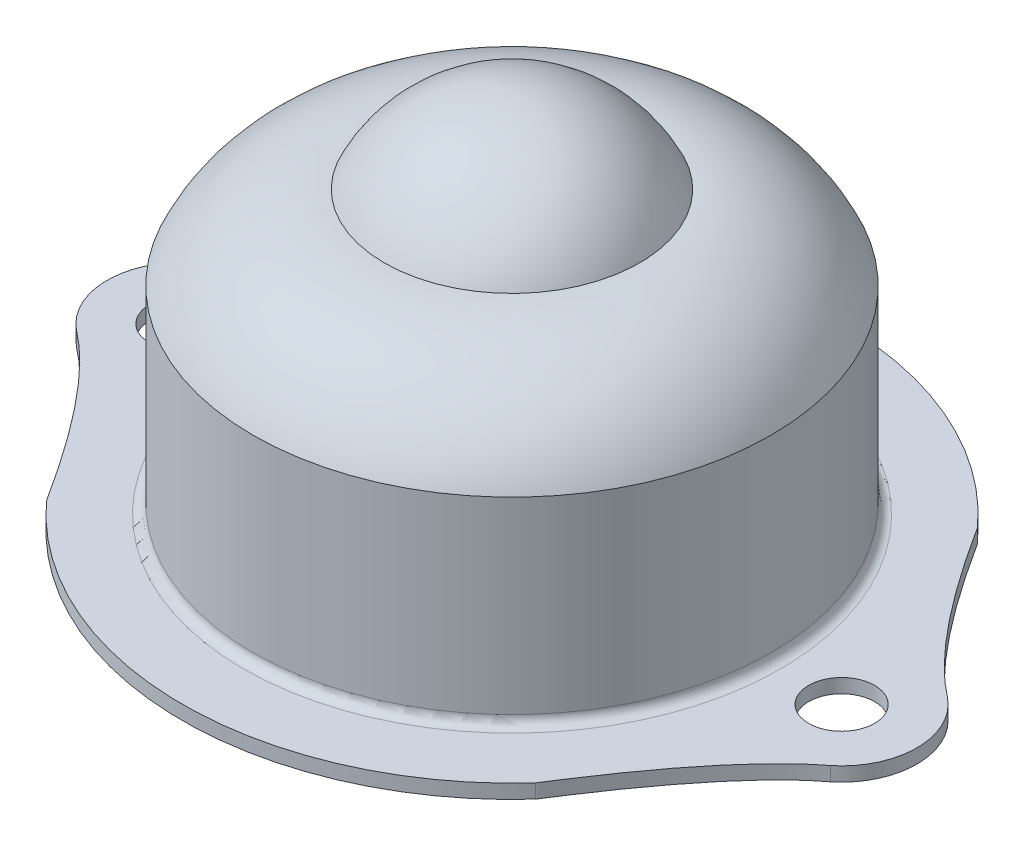
ISO-10303-21;
HEADER;
FILE_DESCRIPTION(('STEP AP214'),'2;1');
FILE_NAME('part.step','',(''),(''),'','','');
FILE_SCHEMA(('AUTOMOTIVE_DESIGN { 1 0 10303 214 1 1 1 1 }'));
ENDSEC;
DATA;
#1=APPLICATION_CONTEXT('core data for automotive mechanical design processes');
#2=APPLICATION_PROTOCOL_DEFINITION('international standard','automotive_design',2000,#1);
#3=PRODUCT_CONTEXT('',#1,'mechanical');
#4=PRODUCT('Part','Part','',(#3));
#5=PRODUCT_RELATED_PRODUCT_CATEGORY('part','',(#4));
#6=PRODUCT_DEFINITION_FORMATION('','',#4);
#7=PRODUCT_DEFINITION_CONTEXT('part definition',#1,'design');
#8=PRODUCT_DEFINITION('design','',#6,#7);
#9=PRODUCT_DEFINITION_SHAPE('','',#8);
#10=(LENGTH_UNIT() NAMED_UNIT(*) SI_UNIT(.MILLI.,.METRE.));
#11=(NAMED_UNIT(*) PLANE_ANGLE_UNIT() SI_UNIT($,.RADIAN.));
#12=(NAMED_UNIT(*) SI_UNIT($,.STERADIAN.) SOLID_ANGLE_UNIT());
#13=UNCERTAINTY_MEASURE_WITH_UNIT(LENGTH_MEASURE(1.E-05),#10,'distance_accuracy_value','');
#14=(GEOMETRIC_REPRESENTATION_CONTEXT(3) GLOBAL_UNCERTAINTY_ASSIGNED_CONTEXT((#13)) GLOBAL_UNIT_ASSIGNED_CONTEXT((#10,
#11,#12)) REPRESENTATION_CONTEXT('',''));
#15=CARTESIAN_POINT('',(0.,0.,0.));
#16=DIRECTION('',(0.,0.,1.));
#17=DIRECTION('',(1.,0.,0.));
#18=AXIS2_PLACEMENT_3D('',#15,#16,#17);
#19=CARTESIAN_POINT('',(0.,24.7942707050077,0.));
#20=DIRECTION('',(0.,1.,0.));
#21=DIRECTION('',(-1.,0.,0.));
#22=AXIS2_PLACEMENT_3D('',#19,#20,#21);
#23=SPHERICAL_SURFACE('',#22,24.7942707050077);
#24=CARTESIAN_POINT('',(0.,20.9856148012532,0.));
#25=DIRECTION('',(0.,1.,0.));
#26=DIRECTION('',(0.,0.,1.));
#27=AXIS2_PLACEMENT_3D('',#24,#25,#26);
#28=CIRCLE('',#27,24.5);
#29=CARTESIAN_POINT('',(0.,20.9856148012532,24.5));
#30=VERTEX_POINT('',#29);
#31=EDGE_CURVE('E11',#30,#30,#28,.T.);
#32=ORIENTED_EDGE('',*,*,#31,.F.);
#33=EDGE_LOOP('',(#32));
#34=FACE_BOUND('',#33,.T.);
#35=ADVANCED_FACE('F45',(#34),#23,.T.);
#36=CARTESIAN_POINT('',(0.,0.,0.));
#37=DIRECTION('',(0.,1.,0.));
#38=DIRECTION('',(0.,0.,1.));
#39=AXIS2_PLACEMENT_3D('',#36,#37,#38);
#40=CONICAL_SURFACE('',#39,24.4663306810924,0.00160439855287027);
#41=ORIENTED_EDGE('',*,*,#31,.T.);
#42=EDGE_LOOP('',(#41));
#43=FACE_BOUND('',#42,.T.);
#44=CARTESIAN_POINT('',(0.,0.,0.));
#45=DIRECTION('',(0.,1.,0.));
#46=DIRECTION('',(0.,0.,1.));
#47=AXIS2_PLACEMENT_3D('',#44,#45,#46);
#48=CIRCLE('',#47,24.4663306810924);
#49=CARTESIAN_POINT('',(0.,0.,24.4663306810924));
#50=VERTEX_POINT('',#49);
#51=EDGE_CURVE('E51',#50,#50,#48,.T.);
#52=ORIENTED_EDGE('',*,*,#51,.F.);
#53=EDGE_LOOP('',(#52));
#54=FACE_BOUND('',#53,.T.);
#55=ADVANCED_FACE('F84',(#43,#54),#40,.F.);
#56=CARTESIAN_POINT('',(-25.9663306810924,0.,0.));
#57=DIRECTION('',(0.,-1.,0.));
#58=DIRECTION('',(0.,0.,-1.));
#59=AXIS2_PLACEMENT_3D('',#56,#57,#58);
#60=PLANE('',#59);
#61=ORIENTED_EDGE('',*,*,#51,.T.);
#62=EDGE_LOOP('',(#61));
#63=FACE_BOUND('',#62,.T.);
#64=CARTESIAN_POINT('',(0.,0.,0.));
#65=DIRECTION('',(0.,1.,0.));
#66=DIRECTION('',(0.,0.,1.));
#67=AXIS2_PLACEMENT_3D('',#64,#65,#66);
#68=CIRCLE('',#67,25.9663306810924);
#69=CARTESIAN_POINT('',(0.,0.,25.9663306810924));
#70=VERTEX_POINT('',#69);
#71=EDGE_CURVE('E55',#70,#70,#68,.T.);
#72=ORIENTED_EDGE('',*,*,#71,.F.);
#73=EDGE_LOOP('',(#72));
#74=FACE_BOUND('',#73,.T.);
#75=ADVANCED_FACE('F80',(#63,#74),#60,.T.);
#76=CARTESIAN_POINT('',(0.,42.,0.));
#77=DIRECTION('',(0.,1.,0.));
#78=DIRECTION('',(0.,0.,1.));
#79=AXIS2_PLACEMENT_3D('',#76,#77,#78);
#80=CYLINDRICAL_SURFACE('',#79,25.9663306810924);
#81=ORIENTED_EDGE('',*,*,#71,.T.);
#82=EDGE_LOOP('',(#81));
#83=FACE_BOUND('',#82,.T.);
#84=CARTESIAN_POINT('',(0.,22.5,0.));
#85=DIRECTION('',(0.,1.,0.));
#86=DIRECTION('',(0.,0.,1.));
#87=AXIS2_PLACEMENT_3D('',#84,#85,#86);
#88=CIRCLE('',#87,25.9663306810924);
#89=CARTESIAN_POINT('',(0.,22.5,25.9663306810924));
#90=VERTEX_POINT('',#89);
#91=EDGE_CURVE('E59',#90,#90,#88,.T.);
#92=ORIENTED_EDGE('',*,*,#91,.F.);
#93=EDGE_LOOP('',(#92));
#94=FACE_BOUND('',#93,.T.);
#95=ADVANCED_FACE('F72',(#83,#94),#80,.T.);
#96=CARTESIAN_POINT('',(-25.9663306810924,22.5,0.));
#97=DIRECTION('',(0.,1.,0.));
#98=DIRECTION('',(0.,0.,1.));
#99=AXIS2_PLACEMENT_3D('',#96,#97,#98);
#100=PLANE('',#99);
#101=ORIENTED_EDGE('',*,*,#91,.T.);
#102=EDGE_LOOP('',(#101));
#103=FACE_BOUND('',#102,.T.);
#104=CARTESIAN_POINT('',(0.,22.5,0.));
#105=DIRECTION('',(0.,1.,0.));
#106=DIRECTION('',(0.,0.,1.));
#107=AXIS2_PLACEMENT_3D('',#104,#105,#106);
#108=CIRCLE('',#107,23.181013127349);
#109=CARTESIAN_POINT('',(0.,22.5,23.181013127349));
#110=VERTEX_POINT('',#109);
#111=EDGE_CURVE('E64',#110,#110,#108,.T.);
#112=ORIENTED_EDGE('',*,*,#111,.F.);
#113=EDGE_LOOP('',(#112));
#114=FACE_BOUND('',#113,.T.);
#115=ADVANCED_FACE('F70',(#103,#114),#100,.T.);
#116=CARTESIAN_POINT('',(0.,24.7942707050077,0.));
#117=DIRECTION('',(0.,1.,0.));
#118=DIRECTION('',(1.,0.,0.));
#119=AXIS2_PLACEMENT_3D('',#116,#117,#118);
#120=SPHERICAL_SURFACE('',#119,23.2942707050077);
#121=ORIENTED_EDGE('',*,*,#111,.T.);
#122=EDGE_LOOP('',(#121));
#123=FACE_BOUND('',#122,.T.);
#124=ADVANCED_FACE('F68',(#123),#120,.F.);
#125=CLOSED_SHELL('',(#35,#55,#75,#95,#115,#124));
#126=MANIFOLD_SOLID_BREP('B2',#125);
#127=CARTESIAN_POINT('',(30.5575764382232,1.5,-16.6540183113107));
#128=DIRECTION('',(0.,1.,0.));
#129=DIRECTION('',(0.,0.,1.));
#130=AXIS2_PLACEMENT_3D('',#127,#128,#129);
#131=PLANE('',#130);
#132=CARTESIAN_POINT('',(0.,1.5,0.));
#133=DIRECTION('',(0.,1.,0.));
#134=DIRECTION('',(0.,0.,1.));
#135=AXIS2_PLACEMENT_3D('',#132,#133,#134);
#136=CIRCLE('',#135,28.5);
#137=CARTESIAN_POINT('',(0.,1.5,28.5));
#138=VERTEX_POINT('',#137);
#139=EDGE_CURVE('E43',#138,#138,#136,.F.);
#140=ORIENTED_EDGE('',*,*,#139,.T.);
#141=EDGE_LOOP('',(#140));
#142=FACE_BOUND('',#141,.T.);
#143=CARTESIAN_POINT('',(40.0282549692665,1.5,-6.22227064374789));
#144=CARTESIAN_POINT('',(33.3096098637212,1.5,-11.2702830143691));
#145=CARTESIAN_POINT('',(26.1790654214209,1.5,-23.243656802868));
#146=CARTESIAN_POINT('',(25.9663306810924,1.5,-23.4680563950268));
#147=B_SPLINE_CURVE_WITH_KNOTS('',3,(#143,#144,#145,#146),.UNSPECIFIED.,.F.,.F.,(4,4),(0.,1.),.UNSPECIFIED.);
#148=CARTESIAN_POINT('',(40.0282549692665,1.5,-6.22227064374789));
#149=VERTEX_POINT('',#148);
#150=CARTESIAN_POINT('',(25.9663306810924,1.5,-23.4680563950268));
#151=VERTEX_POINT('',#150);
#152=EDGE_CURVE('E277',#149,#151,#147,.T.);
#153=ORIENTED_EDGE('',*,*,#152,.T.);
#154=CARTESIAN_POINT('',(0.,1.5,0.));
#155=DIRECTION('',(0.,1.,0.));
#156=DIRECTION('',(0.,0.,1.));
#157=AXIS2_PLACEMENT_3D('',#154,#155,#156);
#158=CIRCLE('',#157,35.);
#159=CARTESIAN_POINT('',(-25.9663306810924,1.5,-23.4680563950268));
#160=VERTEX_POINT('',#159);
#161=EDGE_CURVE('E192',#151,#160,#158,.T.);
#162=ORIENTED_EDGE('',*,*,#161,.T.);
#163=CARTESIAN_POINT('',(-25.9663306810924,1.5,-23.4680563950268));
#164=CARTESIAN_POINT('',(-26.1790654214209,1.5,-23.2436568028679));
#165=CARTESIAN_POINT('',(-33.3096098637212,1.5,-11.2702830143691));
#166=CARTESIAN_POINT('',(-40.0282549692665,1.5,-6.22227064374789));
#167=B_SPLINE_CURVE_WITH_KNOTS('',3,(#163,#164,#165,#166),.UNSPECIFIED.,.F.,.F.,(4,4),(0.,1.),.UNSPECIFIED.);
#168=CARTESIAN_POINT('',(-40.0282549692665,1.5,-6.22227064374789));
#169=VERTEX_POINT('',#168);
#170=EDGE_CURVE('E258',#160,#169,#167,.T.);
#171=ORIENTED_EDGE('',*,*,#170,.T.);
#172=CARTESIAN_POINT('',(-35.,1.5,0.));
#173=DIRECTION('',(0.,1.,0.));
#174=DIRECTION('',(0.,0.,1.));
#175=AXIS2_PLACEMENT_3D('',#172,#173,#174);
#176=CIRCLE('',#175,7.99999999999997);
#177=CARTESIAN_POINT('',(-40.0282549692665,1.5,6.22227064374789));
#178=VERTEX_POINT('',#177);
#179=EDGE_CURVE('E253',#169,#178,#176,.T.);
#180=ORIENTED_EDGE('',*,*,#179,.T.);
#181=CARTESIAN_POINT('',(-40.0282549692665,1.5,6.22227064374789));
#182=CARTESIAN_POINT('',(-33.3096098637212,1.5,11.2702830143691));
#183=CARTESIAN_POINT('',(-26.1790654214209,1.5,23.243656802868));
#184=CARTESIAN_POINT('',(-25.9663306810924,1.5,23.4680563950268));
#185=B_SPLINE_CURVE_WITH_KNOTS('',3,(#181,#182,#183,#184),.UNSPECIFIED.,.F.,.F.,(4,4),(0.,1.),.UNSPECIFIED.);
#186=CARTESIAN_POINT('',(-25.9663306810924,1.5,23.4680563950268));
#187=VERTEX_POINT('',#186);
#188=EDGE_CURVE('E211',#178,#187,#185,.T.);
#189=ORIENTED_EDGE('',*,*,#188,.T.);
#190=CARTESIAN_POINT('',(0.,1.5,0.));
#191=DIRECTION('',(0.,1.,0.));
#192=DIRECTION('',(0.,0.,-1.));
#193=AXIS2_PLACEMENT_3D('',#190,#191,#192);
#194=CIRCLE('',#193,35.);
#195=CARTESIAN_POINT('',(25.9663306810924,1.5,23.4680563950268));
#196=VERTEX_POINT('',#195);
#197=EDGE_CURVE('E205',#187,#196,#194,.T.);
#198=ORIENTED_EDGE('',*,*,#197,.T.);
#199=CARTESIAN_POINT('',(25.9663306810924,1.5,23.4680563950268));
#200=CARTESIAN_POINT('',(26.1790654214209,1.5,23.243656802868));
#201=CARTESIAN_POINT('',(33.3096098637212,1.5,11.2702830143691));
#202=CARTESIAN_POINT('',(40.0282549692665,1.5,6.22227064374789));
#203=B_SPLINE_CURVE_WITH_KNOTS('',3,(#199,#200,#201,#202),.UNSPECIFIED.,.F.,.F.,(4,4),(0.,1.),.UNSPECIFIED.);
#204=CARTESIAN_POINT('',(40.0282549692665,1.5,6.22227064374789));
#205=VERTEX_POINT('',#204);
#206=EDGE_CURVE('E209',#196,#205,#203,.T.);
#207=ORIENTED_EDGE('',*,*,#206,.T.);
#208=CARTESIAN_POINT('',(35.,1.5,0.));
#209=DIRECTION('',(0.,1.,0.));
#210=DIRECTION('',(0.,0.,-1.));
#211=AXIS2_PLACEMENT_3D('',#208,#209,#210);
#212=CIRCLE('',#211,7.99999999999997);
#213=EDGE_CURVE('E148',#205,#149,#212,.T.);
#214=ORIENTED_EDGE('',*,*,#213,.T.);
#215=EDGE_LOOP('',(#153,#162,#171,#180,#189,#198,#207,#214));
#216=FACE_BOUND('',#215,.T.);
#217=CARTESIAN_POINT('',(-35.,1.5,0.));
#218=DIRECTION('',(0.,1.,0.));
#219=DIRECTION('',(0.,0.,1.));
#220=AXIS2_PLACEMENT_3D('',#217,#218,#219);
#221=CIRCLE('',#220,3.5);
#222=CARTESIAN_POINT('',(-35.,1.5,3.5));
#223=VERTEX_POINT('',#222);
#224=EDGE_CURVE('E288',#223,#223,#221,.T.);
#225=ORIENTED_EDGE('',*,*,#224,.F.);
#226=EDGE_LOOP('',(#225));
#227=FACE_BOUND('',#226,.T.);
#228=CARTESIAN_POINT('',(35.,1.5,0.));
#229=DIRECTION('',(0.,1.,0.));
#230=DIRECTION('',(0.,0.,-1.));
#231=AXIS2_PLACEMENT_3D('',#228,#229,#230);
#232=CIRCLE('',#231,3.5);
#233=CARTESIAN_POINT('',(35.,1.5,-3.5));
#234=VERTEX_POINT('',#233);
#235=EDGE_CURVE('E295',#234,#234,#232,.T.);
#236=ORIENTED_EDGE('',*,*,#235,.F.);
#237=EDGE_LOOP('',(#236));
#238=FACE_BOUND('',#237,.T.);
#239=ADVANCED_FACE('F131',(#142,#216,#227,#238),#131,.T.);
#240=CARTESIAN_POINT('',(30.5575764382232,0.,-16.6540183113107));
#241=DIRECTION('',(0.,1.,0.));
#242=DIRECTION('',(0.,0.,1.));
#243=AXIS2_PLACEMENT_3D('',#240,#241,#242);
#244=PLANE('',#243);
#245=CARTESIAN_POINT('',(40.0282549692665,0.,-6.22227064374789));
#246=CARTESIAN_POINT('',(33.3096098637212,0.,-11.2702830143691));
#247=CARTESIAN_POINT('',(26.1790654214209,0.,-23.243656802868));
#248=CARTESIAN_POINT('',(25.9663306810924,0.,-23.4680563950268));
#249=B_SPLINE_CURVE_WITH_KNOTS('',3,(#245,#246,#247,#248),.UNSPECIFIED.,.F.,.F.,(4,4),(0.,1.),.UNSPECIFIED.);
#250=CARTESIAN_POINT('',(40.0282549692665,0.,-6.22227064374789));
#251=VERTEX_POINT('',#250);
#252=CARTESIAN_POINT('',(25.9663306810924,0.,-23.4680563950268));
#253=VERTEX_POINT('',#252);
#254=EDGE_CURVE('E292',#251,#253,#249,.T.);
#255=ORIENTED_EDGE('',*,*,#254,.F.);
#256=CARTESIAN_POINT('',(35.,0.,0.));
#257=DIRECTION('',(0.,1.,0.));
#258=DIRECTION('',(0.,0.,-1.));
#259=AXIS2_PLACEMENT_3D('',#256,#257,#258);
#260=CIRCLE('',#259,7.99999999999997);
#261=CARTESIAN_POINT('',(40.0282549692665,0.,6.22227064374789));
#262=VERTEX_POINT('',#261);
#263=EDGE_CURVE('E183',#262,#251,#260,.T.);
#264=ORIENTED_EDGE('',*,*,#263,.F.);
#265=CARTESIAN_POINT('',(25.9663306810924,0.,23.4680563950268));
#266=CARTESIAN_POINT('',(26.1790654214209,0.,23.243656802868));
#267=CARTESIAN_POINT('',(33.3096098637212,0.,11.2702830143691));
#268=CARTESIAN_POINT('',(40.0282549692665,0.,6.22227064374789));
#269=B_SPLINE_CURVE_WITH_KNOTS('',3,(#265,#266,#267,#268),.UNSPECIFIED.,.F.,.F.,(4,4),(0.,1.),.UNSPECIFIED.);
#270=CARTESIAN_POINT('',(25.9663306810924,0.,23.4680563950268));
#271=VERTEX_POINT('',#270);
#272=EDGE_CURVE('E177',#271,#262,#269,.T.);
#273=ORIENTED_EDGE('',*,*,#272,.F.);
#274=CARTESIAN_POINT('',(0.,0.,0.));
#275=DIRECTION('',(0.,1.,0.));
#276=DIRECTION('',(0.,0.,-1.));
#277=AXIS2_PLACEMENT_3D('',#274,#275,#276);
#278=CIRCLE('',#277,35.);
#279=CARTESIAN_POINT('',(-25.9663306810924,0.,23.4680563950268));
#280=VERTEX_POINT('',#279);
#281=EDGE_CURVE('E219',#280,#271,#278,.T.);
#282=ORIENTED_EDGE('',*,*,#281,.F.);
#283=CARTESIAN_POINT('',(-40.0282549692665,0.,6.22227064374789));
#284=CARTESIAN_POINT('',(-33.3096098637212,0.,11.2702830143691));
#285=CARTESIAN_POINT('',(-26.1790654214209,0.,23.243656802868));
#286=CARTESIAN_POINT('',(-25.9663306810924,0.,23.4680563950268));
#287=B_SPLINE_CURVE_WITH_KNOTS('',3,(#283,#284,#285,#286),.UNSPECIFIED.,.F.,.F.,(4,4),(0.,1.),.UNSPECIFIED.);
#288=CARTESIAN_POINT('',(-40.0282549692665,0.,6.22227064374789));
#289=VERTEX_POINT('',#288);
#290=EDGE_CURVE('E386',#289,#280,#287,.T.);
#291=ORIENTED_EDGE('',*,*,#290,.F.);
#292=CARTESIAN_POINT('',(-35.,0.,0.));
#293=DIRECTION('',(0.,1.,0.));
#294=DIRECTION('',(0.,0.,1.));
#295=AXIS2_PLACEMENT_3D('',#292,#293,#294);
#296=CIRCLE('',#295,7.99999999999997);
#297=CARTESIAN_POINT('',(-40.0282549692665,0.,-6.22227064374789));
#298=VERTEX_POINT('',#297);
#299=EDGE_CURVE('E390',#298,#289,#296,.T.);
#300=ORIENTED_EDGE('',*,*,#299,.F.);
#301=CARTESIAN_POINT('',(-25.9663306810924,0.,-23.4680563950268));
#302=CARTESIAN_POINT('',(-26.1790654214209,0.,-23.2436568028679));
#303=CARTESIAN_POINT('',(-33.3096098637212,0.,-11.2702830143691));
#304=CARTESIAN_POINT('',(-40.0282549692665,0.,-6.22227064374789));
#305=B_SPLINE_CURVE_WITH_KNOTS('',3,(#301,#302,#303,#304),.UNSPECIFIED.,.F.,.F.,(4,4),(0.,1.),.UNSPECIFIED.);
#306=CARTESIAN_POINT('',(-25.9663306810924,0.,-23.4680563950268));
#307=VERTEX_POINT('',#306);
#308=EDGE_CURVE('E395',#307,#298,#305,.T.);
#309=ORIENTED_EDGE('',*,*,#308,.F.);
#310=CARTESIAN_POINT('',(0.,0.,0.));
#311=DIRECTION('',(0.,1.,0.));
#312=DIRECTION('',(0.,0.,1.));
#313=AXIS2_PLACEMENT_3D('',#310,#311,#312);
#314=CIRCLE('',#313,35.);
#315=EDGE_CURVE('E399',#253,#307,#314,.T.);
#316=ORIENTED_EDGE('',*,*,#315,.F.);
#317=EDGE_LOOP('',(#255,#264,#273,#282,#291,#300,#309,#316));
#318=FACE_BOUND('',#317,.T.);
#319=CARTESIAN_POINT('',(-35.,0.,0.));
#320=DIRECTION('',(0.,1.,0.));
#321=DIRECTION('',(0.,0.,1.));
#322=AXIS2_PLACEMENT_3D('',#319,#320,#321);
#323=CIRCLE('',#322,3.5);
#324=CARTESIAN_POINT('',(-35.,0.,3.5));
#325=VERTEX_POINT('',#324);
#326=EDGE_CURVE('E282',#325,#325,#323,.T.);
#327=ORIENTED_EDGE('',*,*,#326,.T.);
#328=EDGE_LOOP('',(#327));
#329=FACE_BOUND('',#328,.T.);
#330=CARTESIAN_POINT('',(0.,0.,0.));
#331=DIRECTION('',(0.,1.,0.));
#332=DIRECTION('',(0.,0.,1.));
#333=AXIS2_PLACEMENT_3D('',#330,#331,#332);
#334=CIRCLE('',#333,26.);
#335=CARTESIAN_POINT('',(0.,0.,26.));
#336=VERTEX_POINT('',#335);
#337=EDGE_CURVE('E289',#336,#336,#334,.T.);
#338=ORIENTED_EDGE('',*,*,#337,.T.);
#339=EDGE_LOOP('',(#338));
#340=FACE_BOUND('',#339,.T.);
#341=CARTESIAN_POINT('',(35.,0.,0.));
#342=DIRECTION('',(0.,1.,0.));
#343=DIRECTION('',(0.,0.,-1.));
#344=AXIS2_PLACEMENT_3D('',#341,#342,#343);
#345=CIRCLE('',#344,3.5);
#346=CARTESIAN_POINT('',(35.,0.,-3.5));
#347=VERTEX_POINT('',#346);
#348=EDGE_CURVE('E296',#347,#347,#345,.T.);
#349=ORIENTED_EDGE('',*,*,#348,.T.);
#350=EDGE_LOOP('',(#349));
#351=FACE_BOUND('',#350,.T.);
#352=ADVANCED_FACE('F275',(#318,#329,#340,#351),#244,.F.);
#353=DIRECTION('',(0.,-1.,0.));
#354=VECTOR('',#353,1.);
#355=SURFACE_OF_LINEAR_EXTRUSION('',#147,#354);
#356=ORIENTED_EDGE('',*,*,#254,.T.);
#357=DIRECTION('',(0.,-1.,0.));
#358=VECTOR('',#357,1.);
#359=CARTESIAN_POINT('',(25.9663306810924,1.5,-23.4680563950268));
#360=LINE('',#359,#358);
#361=EDGE_CURVE('E363',#151,#253,#360,.T.);
#362=ORIENTED_EDGE('',*,*,#361,.F.);
#363=ORIENTED_EDGE('',*,*,#152,.F.);
#364=DIRECTION('',(0.,-1.,0.));
#365=VECTOR('',#364,1.);
#366=CARTESIAN_POINT('',(40.0282549692665,1.5,-6.22227064374789));
#367=LINE('',#366,#365);
#368=EDGE_CURVE('E225',#149,#251,#367,.T.);
#369=ORIENTED_EDGE('',*,*,#368,.T.);
#370=EDGE_LOOP('',(#356,#362,#363,#369));
#371=FACE_BOUND('',#370,.T.);
#372=ADVANCED_FACE('F273',(#371),#355,.F.);
#373=CARTESIAN_POINT('',(0.,1.5,0.));
#374=DIRECTION('',(0.,-1.,0.));
#375=DIRECTION('',(0.,0.,-1.));
#376=AXIS2_PLACEMENT_3D('',#373,#374,#375);
#377=CYLINDRICAL_SURFACE('',#376,35.);
#378=ORIENTED_EDGE('',*,*,#315,.T.);
#379=DIRECTION('',(0.,-1.,0.));
#380=VECTOR('',#379,1.);
#381=CARTESIAN_POINT('',(-25.9663306810924,1.5,-23.4680563950268));
#382=LINE('',#381,#380);
#383=EDGE_CURVE('E364',#160,#307,#382,.T.);
#384=ORIENTED_EDGE('',*,*,#383,.F.);
#385=ORIENTED_EDGE('',*,*,#161,.F.);
#386=ORIENTED_EDGE('',*,*,#361,.T.);
#387=EDGE_LOOP('',(#378,#384,#385,#386));
#388=FACE_BOUND('',#387,.T.);
#389=ADVANCED_FACE('F270',(#388),#377,.T.);
#390=DIRECTION('',(0.,-1.,0.));
#391=VECTOR('',#390,1.);
#392=SURFACE_OF_LINEAR_EXTRUSION('',#167,#391);
#393=ORIENTED_EDGE('',*,*,#308,.T.);
#394=DIRECTION('',(0.,-1.,0.));
#395=VECTOR('',#394,1.);
#396=CARTESIAN_POINT('',(-40.0282549692665,1.5,-6.22227064374789));
#397=LINE('',#396,#395);
#398=EDGE_CURVE('E369',#169,#298,#397,.T.);
#399=ORIENTED_EDGE('',*,*,#398,.F.);
#400=ORIENTED_EDGE('',*,*,#170,.F.);
#401=ORIENTED_EDGE('',*,*,#383,.T.);
#402=EDGE_LOOP('',(#393,#399,#400,#401));
#403=FACE_BOUND('',#402,.T.);
#404=ADVANCED_FACE('F267',(#403),#392,.F.);
#405=CARTESIAN_POINT('',(-35.,1.5,0.));
#406=DIRECTION('',(0.,-1.,0.));
#407=DIRECTION('',(0.,0.,-1.));
#408=AXIS2_PLACEMENT_3D('',#405,#406,#407);
#409=CYLINDRICAL_SURFACE('',#408,7.99999999999997);
#410=ORIENTED_EDGE('',*,*,#299,.T.);
#411=DIRECTION('',(0.,-1.,0.));
#412=VECTOR('',#411,1.);
#413=CARTESIAN_POINT('',(-40.0282549692665,1.5,6.22227064374789));
#414=LINE('',#413,#412);
#415=EDGE_CURVE('E372',#178,#289,#414,.T.);
#416=ORIENTED_EDGE('',*,*,#415,.F.);
#417=ORIENTED_EDGE('',*,*,#179,.F.);
#418=ORIENTED_EDGE('',*,*,#398,.T.);
#419=EDGE_LOOP('',(#410,#416,#417,#418));
#420=FACE_BOUND('',#419,.T.);
#421=ADVANCED_FACE('F246',(#420),#409,.T.);
#422=DIRECTION('',(0.,-1.,0.));
#423=VECTOR('',#422,1.);
#424=SURFACE_OF_LINEAR_EXTRUSION('',#185,#423);
#425=ORIENTED_EDGE('',*,*,#290,.T.);
#426=DIRECTION('',(0.,-1.,0.));
#427=VECTOR('',#426,1.);
#428=CARTESIAN_POINT('',(-25.9663306810924,1.5,23.4680563950268));
#429=LINE('',#428,#427);
#430=EDGE_CURVE('E220',#187,#280,#429,.T.);
#431=ORIENTED_EDGE('',*,*,#430,.F.);
#432=ORIENTED_EDGE('',*,*,#188,.F.);
#433=ORIENTED_EDGE('',*,*,#415,.T.);
#434=EDGE_LOOP('',(#425,#431,#432,#433));
#435=FACE_BOUND('',#434,.T.);
#436=ADVANCED_FACE('F243',(#435),#424,.F.);
#437=CARTESIAN_POINT('',(0.,1.5,0.));
#438=DIRECTION('',(0.,-1.,0.));
#439=DIRECTION('',(0.,0.,-1.));
#440=AXIS2_PLACEMENT_3D('',#437,#438,#439);
#441=CYLINDRICAL_SURFACE('',#440,35.);
#442=ORIENTED_EDGE('',*,*,#281,.T.);
#443=DIRECTION('',(0.,-1.,0.));
#444=VECTOR('',#443,1.);
#445=CARTESIAN_POINT('',(25.9663306810924,1.5,23.4680563950268));
#446=LINE('',#445,#444);
#447=EDGE_CURVE('E216',#196,#271,#446,.T.);
#448=ORIENTED_EDGE('',*,*,#447,.F.);
#449=ORIENTED_EDGE('',*,*,#197,.F.);
#450=ORIENTED_EDGE('',*,*,#430,.T.);
#451=EDGE_LOOP('',(#442,#448,#449,#450));
#452=FACE_BOUND('',#451,.T.);
#453=ADVANCED_FACE('F217',(#452),#441,.T.);
#454=DIRECTION('',(0.,-1.,0.));
#455=VECTOR('',#454,1.);
#456=SURFACE_OF_LINEAR_EXTRUSION('',#203,#455);
#457=ORIENTED_EDGE('',*,*,#272,.T.);
#458=DIRECTION('',(0.,-1.,0.));
#459=VECTOR('',#458,1.);
#460=CARTESIAN_POINT('',(40.0282549692665,1.5,6.22227064374789));
#461=LINE('',#460,#459);
#462=EDGE_CURVE('E221',#205,#262,#461,.T.);
#463=ORIENTED_EDGE('',*,*,#462,.F.);
#464=ORIENTED_EDGE('',*,*,#206,.F.);
#465=ORIENTED_EDGE('',*,*,#447,.T.);
#466=EDGE_LOOP('',(#457,#463,#464,#465));
#467=FACE_BOUND('',#466,.T.);
#468=ADVANCED_FACE('F223',(#467),#456,.F.);
#469=CARTESIAN_POINT('',(35.,1.5,0.));
#470=DIRECTION('',(0.,-1.,0.));
#471=DIRECTION('',(0.,0.,-1.));
#472=AXIS2_PLACEMENT_3D('',#469,#470,#471);
#473=CYLINDRICAL_SURFACE('',#472,7.99999999999997);
#474=ORIENTED_EDGE('',*,*,#263,.T.);
#475=ORIENTED_EDGE('',*,*,#368,.F.);
#476=ORIENTED_EDGE('',*,*,#213,.F.);
#477=ORIENTED_EDGE('',*,*,#462,.T.);
#478=EDGE_LOOP('',(#474,#475,#476,#477));
#479=FACE_BOUND('',#478,.T.);
#480=ADVANCED_FACE('F239',(#479),#473,.T.);
#481=CARTESIAN_POINT('',(-35.,1.5,0.));
#482=DIRECTION('',(0.,-1.,0.));
#483=DIRECTION('',(0.,0.,-1.));
#484=AXIS2_PLACEMENT_3D('',#481,#482,#483);
#485=CYLINDRICAL_SURFACE('',#484,3.5);
#486=ORIENTED_EDGE('',*,*,#224,.T.);
#487=EDGE_LOOP('',(#486));
#488=FACE_BOUND('',#487,.T.);
#489=ORIENTED_EDGE('',*,*,#326,.F.);
#490=EDGE_LOOP('',(#489));
#491=FACE_BOUND('',#490,.T.);
#492=ADVANCED_FACE('F339',(#488,#491),#485,.F.);
#493=CARTESIAN_POINT('',(0.,1.5,0.));
#494=DIRECTION('',(0.,-1.,0.));
#495=DIRECTION('',(0.,0.,-1.));
#496=AXIS2_PLACEMENT_3D('',#493,#494,#495);
#497=CYLINDRICAL_SURFACE('',#496,26.);
#498=ORIENTED_EDGE('',*,*,#337,.F.);
#499=EDGE_LOOP('',(#498));
#500=FACE_BOUND('',#499,.T.);
#501=CARTESIAN_POINT('',(0.,22.5,0.));
#502=DIRECTION('',(0.,1.,0.));
#503=DIRECTION('',(0.,0.,1.));
#504=AXIS2_PLACEMENT_3D('',#501,#502,#503);
#505=CIRCLE('',#504,26.);
#506=CARTESIAN_POINT('',(0.,22.5,26.));
#507=VERTEX_POINT('',#506);
#508=EDGE_CURVE('E307',#507,#507,#505,.T.);
#509=ORIENTED_EDGE('',*,*,#508,.T.);
#510=EDGE_LOOP('',(#509));
#511=FACE_BOUND('',#510,.T.);
#512=ADVANCED_FACE('F328',(#500,#511),#497,.F.);
#513=CARTESIAN_POINT('',(35.,1.5,0.));
#514=DIRECTION('',(0.,-1.,0.));
#515=DIRECTION('',(0.,0.,-1.));
#516=AXIS2_PLACEMENT_3D('',#513,#514,#515);
#517=CYLINDRICAL_SURFACE('',#516,3.5);
#518=ORIENTED_EDGE('',*,*,#235,.T.);
#519=EDGE_LOOP('',(#518));
#520=FACE_BOUND('',#519,.T.);
#521=ORIENTED_EDGE('',*,*,#348,.F.);
#522=EDGE_LOOP('',(#521));
#523=FACE_BOUND('',#522,.T.);
#524=ADVANCED_FACE('F318',(#520,#523),#517,.F.);
#525=CARTESIAN_POINT('',(0.,25.,0.));
#526=DIRECTION('',(0.,1.,0.));
#527=DIRECTION('',(0.,0.,1.));
#528=AXIS2_PLACEMENT_3D('',#525,#526,#527);
#529=SPHERICAL_SURFACE('',#528,15.);
#530=CARTESIAN_POINT('',(0.,30.,0.));
#531=DIRECTION('',(0.,1.,0.));
#532=DIRECTION('',(0.,0.,1.));
#533=AXIS2_PLACEMENT_3D('',#530,#531,#532);
#534=CIRCLE('',#533,14.142135623731);
#535=CARTESIAN_POINT('',(0.,30.,14.142135623731));
#536=VERTEX_POINT('',#535);
#537=EDGE_CURVE('E310',#536,#536,#534,.T.);
#538=ORIENTED_EDGE('',*,*,#537,.F.);
#539=EDGE_LOOP('',(#538));
#540=FACE_BOUND('',#539,.T.);
#541=ADVANCED_FACE('F316',(#540),#529,.T.);
#542=CARTESIAN_POINT('',(0.,15.0447866247774,0.));
#543=DIRECTION('',(0.,1.,0.));
#544=DIRECTION('',(0.,0.,1.));
#545=AXIS2_PLACEMENT_3D('',#542,#543,#544);
#546=DEGENERATE_TOROIDAL_SURFACE('',#545,12.9838641091182,15.,.T.);
#547=ORIENTED_EDGE('',*,*,#508,.F.);
#548=EDGE_LOOP('',(#547));
#549=FACE_BOUND('',#548,.T.);
#550=ORIENTED_EDGE('',*,*,#537,.T.);
#551=EDGE_LOOP('',(#550));
#552=FACE_BOUND('',#551,.T.);
#553=ADVANCED_FACE('F314',(#549,#552),#546,.F.);
#554=CARTESIAN_POINT('',(0.,25.,0.));
#555=DIRECTION('',(0.,1.,0.));
#556=DIRECTION('',(0.,0.,-1.));
#557=AXIS2_PLACEMENT_3D('',#554,#555,#556);
#558=SPHERICAL_SURFACE('',#557,15.);
#559=CARTESIAN_POINT('',(0.,31.3874446891826,0.));
#560=DIRECTION('',(0.,1.,0.));
#561=DIRECTION('',(0.,0.,1.));
#562=AXIS2_PLACEMENT_3D('',#559,#560,#561);
#563=CIRCLE('',#562,13.5720503367263);
#564=CARTESIAN_POINT('',(0.,31.3874446891826,13.5720503367263));
#565=VERTEX_POINT('',#564);
#566=EDGE_CURVE('E299',#565,#565,#563,.T.);
#567=ORIENTED_EDGE('',*,*,#566,.T.);
#568=EDGE_LOOP('',(#567));
#569=FACE_BOUND('',#568,.T.);
#570=ADVANCED_FACE('F324',(#569),#558,.T.);
#571=CARTESIAN_POINT('',(0.,42.,0.));
#572=DIRECTION('',(0.,1.,0.));
#573=DIRECTION('',(0.,0.,1.));
#574=AXIS2_PLACEMENT_3D('',#571,#572,#573);
#575=CYLINDRICAL_SURFACE('',#574,27.5);
#576=CARTESIAN_POINT('',(0.,2.5,0.));
#577=DIRECTION('',(0.,1.,0.));
#578=DIRECTION('',(0.,0.,1.));
#579=AXIS2_PLACEMENT_3D('',#576,#577,#578);
#580=CIRCLE('',#579,27.5);
#581=CARTESIAN_POINT('',(0.,2.5,27.5));
#582=VERTEX_POINT('',#581);
#583=EDGE_CURVE('E140',#582,#582,#580,.T.);
#584=ORIENTED_EDGE('',*,*,#583,.T.);
#585=EDGE_LOOP('',(#584));
#586=FACE_BOUND('',#585,.T.);
#587=CARTESIAN_POINT('',(0.,22.5,0.));
#588=DIRECTION('',(0.,1.,0.));
#589=DIRECTION('',(0.,0.,1.));
#590=AXIS2_PLACEMENT_3D('',#587,#588,#589);
#591=CIRCLE('',#590,27.5);
#592=CARTESIAN_POINT('',(0.,22.5,27.5));
#593=VERTEX_POINT('',#592);
#594=EDGE_CURVE('E304',#593,#593,#591,.T.);
#595=ORIENTED_EDGE('',*,*,#594,.F.);
#596=EDGE_LOOP('',(#595));
#597=FACE_BOUND('',#596,.T.);
#598=ADVANCED_FACE('F327',(#586,#597),#575,.T.);
#599=CARTESIAN_POINT('',(0.,16.3273495160593,0.));
#600=DIRECTION('',(0.,1.,0.));
#601=DIRECTION('',(0.,0.,1.));
#602=AXIS2_PLACEMENT_3D('',#599,#600,#601);
#603=DEGENERATE_TOROIDAL_SURFACE('',#602,13.7617024148775,15.0612892719805,.T.);
#604=ORIENTED_EDGE('',*,*,#566,.F.);
#605=EDGE_LOOP('',(#604));
#606=FACE_BOUND('',#605,.T.);
#607=ORIENTED_EDGE('',*,*,#594,.T.);
#608=EDGE_LOOP('',(#607));
#609=FACE_BOUND('',#608,.T.);
#610=ADVANCED_FACE('F349',(#606,#609),#603,.T.);
#611=CARTESIAN_POINT('',(0.,2.5,0.));
#612=DIRECTION('',(0.,1.,0.));
#613=DIRECTION('',(0.,0.,1.));
#614=AXIS2_PLACEMENT_3D('',#611,#612,#613);
#615=TOROIDAL_SURFACE('',#614,28.5,1.);
#616=ORIENTED_EDGE('',*,*,#139,.F.);
#617=EDGE_LOOP('',(#616));
#618=FACE_BOUND('',#617,.T.);
#619=ORIENTED_EDGE('',*,*,#583,.F.);
#620=EDGE_LOOP('',(#619));
#621=FACE_BOUND('',#620,.T.);
#622=ADVANCED_FACE('F133',(#618,#621),#615,.F.);
#623=CLOSED_SHELL('',(#239,#352,#372,#389,#404,#421,#436,#453,#468,#480,#492,#512,#524,#541,
#553,#570,#598,#610,#622));
#624=MANIFOLD_SOLID_BREP('B6',#623);
#625=ADVANCED_BREP_SHAPE_REPRESENTATION('',(#18,#126,#624),#14);
#626=SHAPE_DEFINITION_REPRESENTATION(#9,#625);
ENDSEC;
END-ISO-10303-21;
